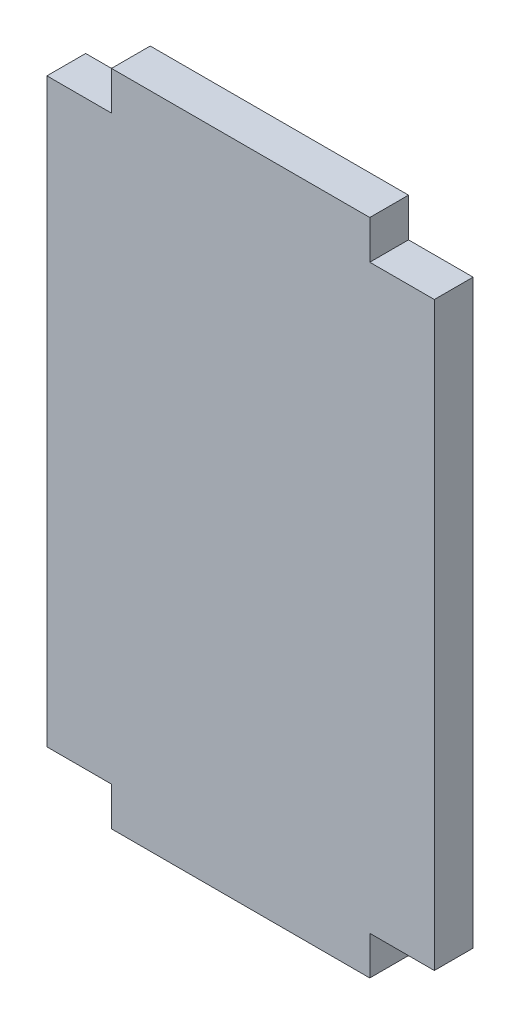
ISO-10303-21;
HEADER;
FILE_DESCRIPTION(('STEP AP214'),'2;1');
FILE_NAME('part.step','',(''),(''),'','','');
FILE_SCHEMA(('AUTOMOTIVE_DESIGN { 1 0 10303 214 1 1 1 1 }'));
ENDSEC;
DATA;
#1=APPLICATION_CONTEXT('core data for automotive mechanical design processes');
#2=APPLICATION_PROTOCOL_DEFINITION('international standard','automotive_design',2000,#1);
#3=PRODUCT_CONTEXT('',#1,'mechanical');
#4=PRODUCT('Part','Part','',(#3));
#5=PRODUCT_RELATED_PRODUCT_CATEGORY('part','',(#4));
#6=PRODUCT_DEFINITION_FORMATION('','',#4);
#7=PRODUCT_DEFINITION_CONTEXT('part definition',#1,'design');
#8=PRODUCT_DEFINITION('design','',#6,#7);
#9=PRODUCT_DEFINITION_SHAPE('','',#8);
#10=(LENGTH_UNIT() NAMED_UNIT(*) SI_UNIT(.MILLI.,.METRE.));
#11=(NAMED_UNIT(*) PLANE_ANGLE_UNIT() SI_UNIT($,.RADIAN.));
#12=(NAMED_UNIT(*) SI_UNIT($,.STERADIAN.) SOLID_ANGLE_UNIT());
#13=UNCERTAINTY_MEASURE_WITH_UNIT(LENGTH_MEASURE(1.E-05),#10,'distance_accuracy_value','');
#14=(GEOMETRIC_REPRESENTATION_CONTEXT(3) GLOBAL_UNCERTAINTY_ASSIGNED_CONTEXT((#13)) GLOBAL_UNIT_ASSIGNED_CONTEXT((#10,
#11,#12)) REPRESENTATION_CONTEXT('',''));
#15=CARTESIAN_POINT('',(0.,0.,0.));
#16=DIRECTION('',(0.,0.,1.));
#17=DIRECTION('',(1.,0.,0.));
#18=AXIS2_PLACEMENT_3D('',#15,#16,#17);
#19=CARTESIAN_POINT('',(-10.,22.5,3.));
#20=DIRECTION('',(1.,0.,0.));
#21=DIRECTION('',(0.,0.,-1.));
#22=AXIS2_PLACEMENT_3D('',#19,#20,#21);
#23=PLANE('',#22);
#24=DIRECTION('',(0.,-1.,0.));
#25=VECTOR('',#24,1.);
#26=CARTESIAN_POINT('',(-10.,22.5,0.));
#27=LINE('',#26,#25);
#28=CARTESIAN_POINT('',(-10.,25.5,0.));
#29=VERTEX_POINT('',#28);
#30=CARTESIAN_POINT('',(-10.,22.5,0.));
#31=VERTEX_POINT('',#30);
#32=EDGE_CURVE('E164',#29,#31,#27,.T.);
#33=ORIENTED_EDGE('',*,*,#32,.T.);
#34=DIRECTION('',(0.,0.,-1.));
#35=VECTOR('',#34,1.);
#36=CARTESIAN_POINT('',(-10.,22.5,3.));
#37=LINE('',#36,#35);
#38=CARTESIAN_POINT('',(-10.,22.5,3.));
#39=VERTEX_POINT('',#38);
#40=EDGE_CURVE('E11',#39,#31,#37,.T.);
#41=ORIENTED_EDGE('',*,*,#40,.F.);
#42=DIRECTION('',(0.,-1.,0.));
#43=VECTOR('',#42,1.);
#44=CARTESIAN_POINT('',(-10.,22.5,3.));
#45=LINE('',#44,#43);
#46=CARTESIAN_POINT('',(-10.,25.5,3.));
#47=VERTEX_POINT('',#46);
#48=EDGE_CURVE('E198',#47,#39,#45,.T.);
#49=ORIENTED_EDGE('',*,*,#48,.F.);
#50=DIRECTION('',(0.,0.,-1.));
#51=VECTOR('',#50,1.);
#52=CARTESIAN_POINT('',(-10.,25.5,3.));
#53=LINE('',#52,#51);
#54=EDGE_CURVE('E160',#47,#29,#53,.T.);
#55=ORIENTED_EDGE('',*,*,#54,.T.);
#56=EDGE_LOOP('',(#33,#41,#49,#55));
#57=FACE_BOUND('',#56,.T.);
#58=ADVANCED_FACE('F39',(#57),#23,.F.);
#59=CARTESIAN_POINT('',(-15.,22.5,3.));
#60=DIRECTION('',(0.,-1.,0.));
#61=DIRECTION('',(1.,0.,0.));
#62=AXIS2_PLACEMENT_3D('',#59,#60,#61);
#63=PLANE('',#62);
#64=DIRECTION('',(-1.,0.,0.));
#65=VECTOR('',#64,1.);
#66=CARTESIAN_POINT('',(-15.,22.5,0.));
#67=LINE('',#66,#65);
#68=CARTESIAN_POINT('',(-15.,22.5,0.));
#69=VERTEX_POINT('',#68);
#70=EDGE_CURVE('E168',#31,#69,#67,.T.);
#71=ORIENTED_EDGE('',*,*,#70,.T.);
#72=DIRECTION('',(0.,0.,-1.));
#73=VECTOR('',#72,1.);
#74=CARTESIAN_POINT('',(-15.,22.5,3.));
#75=LINE('',#74,#73);
#76=CARTESIAN_POINT('',(-15.,22.5,3.));
#77=VERTEX_POINT('',#76);
#78=EDGE_CURVE('E48',#77,#69,#75,.T.);
#79=ORIENTED_EDGE('',*,*,#78,.F.);
#80=DIRECTION('',(-1.,0.,0.));
#81=VECTOR('',#80,1.);
#82=CARTESIAN_POINT('',(-15.,22.5,3.));
#83=LINE('',#82,#81);
#84=EDGE_CURVE('E111',#39,#77,#83,.T.);
#85=ORIENTED_EDGE('',*,*,#84,.F.);
#86=ORIENTED_EDGE('',*,*,#40,.T.);
#87=EDGE_LOOP('',(#71,#79,#85,#86));
#88=FACE_BOUND('',#87,.T.);
#89=ADVANCED_FACE('F292',(#88),#63,.F.);
#90=CARTESIAN_POINT('',(-15.,-22.5,3.));
#91=DIRECTION('',(1.,0.,0.));
#92=DIRECTION('',(0.,0.,-1.));
#93=AXIS2_PLACEMENT_3D('',#90,#91,#92);
#94=PLANE('',#93);
#95=DIRECTION('',(0.,-1.,0.));
#96=VECTOR('',#95,1.);
#97=CARTESIAN_POINT('',(-15.,-22.5,0.));
#98=LINE('',#97,#96);
#99=CARTESIAN_POINT('',(-15.,-22.5,0.));
#100=VERTEX_POINT('',#99);
#101=EDGE_CURVE('E171',#69,#100,#98,.T.);
#102=ORIENTED_EDGE('',*,*,#101,.T.);
#103=DIRECTION('',(0.,0.,-1.));
#104=VECTOR('',#103,1.);
#105=CARTESIAN_POINT('',(-15.,-22.5,3.));
#106=LINE('',#105,#104);
#107=CARTESIAN_POINT('',(-15.,-22.5,3.));
#108=VERTEX_POINT('',#107);
#109=EDGE_CURVE('E225',#108,#100,#106,.T.);
#110=ORIENTED_EDGE('',*,*,#109,.F.);
#111=DIRECTION('',(0.,-1.,0.));
#112=VECTOR('',#111,1.);
#113=CARTESIAN_POINT('',(-15.,-22.5,3.));
#114=LINE('',#113,#112);
#115=EDGE_CURVE('E235',#77,#108,#114,.T.);
#116=ORIENTED_EDGE('',*,*,#115,.F.);
#117=ORIENTED_EDGE('',*,*,#78,.T.);
#118=EDGE_LOOP('',(#102,#110,#116,#117));
#119=FACE_BOUND('',#118,.T.);
#120=ADVANCED_FACE('F233',(#119),#94,.F.);
#121=CARTESIAN_POINT('',(-10.,-22.5,3.));
#122=DIRECTION('',(0.,1.,0.));
#123=DIRECTION('',(-1.,0.,0.));
#124=AXIS2_PLACEMENT_3D('',#121,#122,#123);
#125=PLANE('',#124);
#126=DIRECTION('',(1.,0.,0.));
#127=VECTOR('',#126,1.);
#128=CARTESIAN_POINT('',(-10.,-22.5,0.));
#129=LINE('',#128,#127);
#130=CARTESIAN_POINT('',(-10.,-22.5,0.));
#131=VERTEX_POINT('',#130);
#132=EDGE_CURVE('E174',#100,#131,#129,.T.);
#133=ORIENTED_EDGE('',*,*,#132,.T.);
#134=DIRECTION('',(0.,0.,-1.));
#135=VECTOR('',#134,1.);
#136=CARTESIAN_POINT('',(-10.,-22.5,3.));
#137=LINE('',#136,#135);
#138=CARTESIAN_POINT('',(-10.,-22.5,3.));
#139=VERTEX_POINT('',#138);
#140=EDGE_CURVE('E221',#139,#131,#137,.T.);
#141=ORIENTED_EDGE('',*,*,#140,.F.);
#142=DIRECTION('',(1.,0.,0.));
#143=VECTOR('',#142,1.);
#144=CARTESIAN_POINT('',(-10.,-22.5,3.));
#145=LINE('',#144,#143);
#146=EDGE_CURVE('E254',#108,#139,#145,.T.);
#147=ORIENTED_EDGE('',*,*,#146,.F.);
#148=ORIENTED_EDGE('',*,*,#109,.T.);
#149=EDGE_LOOP('',(#133,#141,#147,#148));
#150=FACE_BOUND('',#149,.T.);
#151=ADVANCED_FACE('F244',(#150),#125,.F.);
#152=CARTESIAN_POINT('',(-10.,-25.5,3.));
#153=DIRECTION('',(1.,0.,0.));
#154=DIRECTION('',(0.,0.,-1.));
#155=AXIS2_PLACEMENT_3D('',#152,#153,#154);
#156=PLANE('',#155);
#157=DIRECTION('',(0.,-1.,0.));
#158=VECTOR('',#157,1.);
#159=CARTESIAN_POINT('',(-10.,-25.5,0.));
#160=LINE('',#159,#158);
#161=CARTESIAN_POINT('',(-10.,-25.5,0.));
#162=VERTEX_POINT('',#161);
#163=EDGE_CURVE('E177',#131,#162,#160,.T.);
#164=ORIENTED_EDGE('',*,*,#163,.T.);
#165=DIRECTION('',(0.,0.,-1.));
#166=VECTOR('',#165,1.);
#167=CARTESIAN_POINT('',(-10.,-25.5,3.));
#168=LINE('',#167,#166);
#169=CARTESIAN_POINT('',(-10.,-25.5,3.));
#170=VERTEX_POINT('',#169);
#171=EDGE_CURVE('E217',#170,#162,#168,.T.);
#172=ORIENTED_EDGE('',*,*,#171,.F.);
#173=DIRECTION('',(0.,-1.,0.));
#174=VECTOR('',#173,1.);
#175=CARTESIAN_POINT('',(-10.,-25.5,3.));
#176=LINE('',#175,#174);
#177=EDGE_CURVE('E250',#139,#170,#176,.T.);
#178=ORIENTED_EDGE('',*,*,#177,.F.);
#179=ORIENTED_EDGE('',*,*,#140,.T.);
#180=EDGE_LOOP('',(#164,#172,#178,#179));
#181=FACE_BOUND('',#180,.T.);
#182=ADVANCED_FACE('F248',(#181),#156,.F.);
#183=CARTESIAN_POINT('',(10.,-25.5,3.));
#184=DIRECTION('',(0.,1.,0.));
#185=DIRECTION('',(0.,0.,1.));
#186=AXIS2_PLACEMENT_3D('',#183,#184,#185);
#187=PLANE('',#186);
#188=DIRECTION('',(1.,0.,0.));
#189=VECTOR('',#188,1.);
#190=CARTESIAN_POINT('',(10.,-25.5,0.));
#191=LINE('',#190,#189);
#192=CARTESIAN_POINT('',(10.,-25.5,0.));
#193=VERTEX_POINT('',#192);
#194=EDGE_CURVE('E180',#162,#193,#191,.T.);
#195=ORIENTED_EDGE('',*,*,#194,.T.);
#196=DIRECTION('',(0.,0.,-1.));
#197=VECTOR('',#196,1.);
#198=CARTESIAN_POINT('',(10.,-25.5,3.));
#199=LINE('',#198,#197);
#200=CARTESIAN_POINT('',(10.,-25.5,3.));
#201=VERTEX_POINT('',#200);
#202=EDGE_CURVE('E213',#201,#193,#199,.T.);
#203=ORIENTED_EDGE('',*,*,#202,.F.);
#204=DIRECTION('',(1.,0.,0.));
#205=VECTOR('',#204,1.);
#206=CARTESIAN_POINT('',(10.,-25.5,3.));
#207=LINE('',#206,#205);
#208=EDGE_CURVE('E253',#170,#201,#207,.T.);
#209=ORIENTED_EDGE('',*,*,#208,.F.);
#210=ORIENTED_EDGE('',*,*,#171,.T.);
#211=EDGE_LOOP('',(#195,#203,#209,#210));
#212=FACE_BOUND('',#211,.T.);
#213=ADVANCED_FACE('F305',(#212),#187,.F.);
#214=CARTESIAN_POINT('',(10.,-22.5,3.));
#215=DIRECTION('',(-1.,0.,0.));
#216=DIRECTION('',(0.,0.,1.));
#217=AXIS2_PLACEMENT_3D('',#214,#215,#216);
#218=PLANE('',#217);
#219=DIRECTION('',(0.,1.,0.));
#220=VECTOR('',#219,1.);
#221=CARTESIAN_POINT('',(10.,-22.5,0.));
#222=LINE('',#221,#220);
#223=CARTESIAN_POINT('',(10.,-22.5,0.));
#224=VERTEX_POINT('',#223);
#225=EDGE_CURVE('E183',#193,#224,#222,.T.);
#226=ORIENTED_EDGE('',*,*,#225,.T.);
#227=DIRECTION('',(0.,0.,-1.));
#228=VECTOR('',#227,1.);
#229=CARTESIAN_POINT('',(10.,-22.5,3.));
#230=LINE('',#229,#228);
#231=CARTESIAN_POINT('',(10.,-22.5,3.));
#232=VERTEX_POINT('',#231);
#233=EDGE_CURVE('E209',#232,#224,#230,.T.);
#234=ORIENTED_EDGE('',*,*,#233,.F.);
#235=DIRECTION('',(0.,1.,0.));
#236=VECTOR('',#235,1.);
#237=CARTESIAN_POINT('',(10.,-22.5,3.));
#238=LINE('',#237,#236);
#239=EDGE_CURVE('E258',#201,#232,#238,.T.);
#240=ORIENTED_EDGE('',*,*,#239,.F.);
#241=ORIENTED_EDGE('',*,*,#202,.T.);
#242=EDGE_LOOP('',(#226,#234,#240,#241));
#243=FACE_BOUND('',#242,.T.);
#244=ADVANCED_FACE('F308',(#243),#218,.F.);
#245=CARTESIAN_POINT('',(15.,-22.5,3.));
#246=DIRECTION('',(0.,1.,0.));
#247=DIRECTION('',(-1.,0.,0.));
#248=AXIS2_PLACEMENT_3D('',#245,#246,#247);
#249=PLANE('',#248);
#250=DIRECTION('',(1.,0.,0.));
#251=VECTOR('',#250,1.);
#252=CARTESIAN_POINT('',(15.,-22.5,0.));
#253=LINE('',#252,#251);
#254=CARTESIAN_POINT('',(15.,-22.5,0.));
#255=VERTEX_POINT('',#254);
#256=EDGE_CURVE('E186',#224,#255,#253,.T.);
#257=ORIENTED_EDGE('',*,*,#256,.T.);
#258=DIRECTION('',(0.,0.,-1.));
#259=VECTOR('',#258,1.);
#260=CARTESIAN_POINT('',(15.,-22.5,3.));
#261=LINE('',#260,#259);
#262=CARTESIAN_POINT('',(15.,-22.5,3.));
#263=VERTEX_POINT('',#262);
#264=EDGE_CURVE('E205',#263,#255,#261,.T.);
#265=ORIENTED_EDGE('',*,*,#264,.F.);
#266=DIRECTION('',(1.,0.,0.));
#267=VECTOR('',#266,1.);
#268=CARTESIAN_POINT('',(15.,-22.5,3.));
#269=LINE('',#268,#267);
#270=EDGE_CURVE('E265',#232,#263,#269,.T.);
#271=ORIENTED_EDGE('',*,*,#270,.F.);
#272=ORIENTED_EDGE('',*,*,#233,.T.);
#273=EDGE_LOOP('',(#257,#265,#271,#272));
#274=FACE_BOUND('',#273,.T.);
#275=ADVANCED_FACE('F273',(#274),#249,.F.);
#276=CARTESIAN_POINT('',(15.,22.5,3.));
#277=DIRECTION('',(-1.,0.,0.));
#278=DIRECTION('',(0.,0.,1.));
#279=AXIS2_PLACEMENT_3D('',#276,#277,#278);
#280=PLANE('',#279);
#281=DIRECTION('',(0.,1.,0.));
#282=VECTOR('',#281,1.);
#283=CARTESIAN_POINT('',(15.,22.5,0.));
#284=LINE('',#283,#282);
#285=CARTESIAN_POINT('',(15.,22.5,0.));
#286=VERTEX_POINT('',#285);
#287=EDGE_CURVE('E189',#255,#286,#284,.T.);
#288=ORIENTED_EDGE('',*,*,#287,.T.);
#289=DIRECTION('',(0.,0.,-1.));
#290=VECTOR('',#289,1.);
#291=CARTESIAN_POINT('',(15.,22.5,3.));
#292=LINE('',#291,#290);
#293=CARTESIAN_POINT('',(15.,22.5,3.));
#294=VERTEX_POINT('',#293);
#295=EDGE_CURVE('E153',#294,#286,#292,.T.);
#296=ORIENTED_EDGE('',*,*,#295,.F.);
#297=DIRECTION('',(0.,1.,0.));
#298=VECTOR('',#297,1.);
#299=CARTESIAN_POINT('',(15.,22.5,3.));
#300=LINE('',#299,#298);
#301=EDGE_CURVE('E142',#263,#294,#300,.T.);
#302=ORIENTED_EDGE('',*,*,#301,.F.);
#303=ORIENTED_EDGE('',*,*,#264,.T.);
#304=EDGE_LOOP('',(#288,#296,#302,#303));
#305=FACE_BOUND('',#304,.T.);
#306=ADVANCED_FACE('F277',(#305),#280,.F.);
#307=CARTESIAN_POINT('',(10.,22.5,3.));
#308=DIRECTION('',(0.,-1.,0.));
#309=DIRECTION('',(1.,0.,0.));
#310=AXIS2_PLACEMENT_3D('',#307,#308,#309);
#311=PLANE('',#310);
#312=DIRECTION('',(-1.,0.,0.));
#313=VECTOR('',#312,1.);
#314=CARTESIAN_POINT('',(10.,22.5,0.));
#315=LINE('',#314,#313);
#316=CARTESIAN_POINT('',(10.,22.5,0.));
#317=VERTEX_POINT('',#316);
#318=EDGE_CURVE('E151',#286,#317,#315,.T.);
#319=ORIENTED_EDGE('',*,*,#318,.T.);
#320=DIRECTION('',(0.,0.,-1.));
#321=VECTOR('',#320,1.);
#322=CARTESIAN_POINT('',(10.,22.5,3.));
#323=LINE('',#322,#321);
#324=CARTESIAN_POINT('',(10.,22.5,3.));
#325=VERTEX_POINT('',#324);
#326=EDGE_CURVE('E148',#325,#317,#323,.T.);
#327=ORIENTED_EDGE('',*,*,#326,.F.);
#328=DIRECTION('',(-1.,0.,0.));
#329=VECTOR('',#328,1.);
#330=CARTESIAN_POINT('',(10.,22.5,3.));
#331=LINE('',#330,#329);
#332=EDGE_CURVE('E136',#294,#325,#331,.T.);
#333=ORIENTED_EDGE('',*,*,#332,.F.);
#334=ORIENTED_EDGE('',*,*,#295,.T.);
#335=EDGE_LOOP('',(#319,#327,#333,#334));
#336=FACE_BOUND('',#335,.T.);
#337=ADVANCED_FACE('F149',(#336),#311,.F.);
#338=CARTESIAN_POINT('',(10.,25.5,3.));
#339=DIRECTION('',(-1.,0.,0.));
#340=DIRECTION('',(0.,0.,1.));
#341=AXIS2_PLACEMENT_3D('',#338,#339,#340);
#342=PLANE('',#341);
#343=DIRECTION('',(0.,1.,0.));
#344=VECTOR('',#343,1.);
#345=CARTESIAN_POINT('',(10.,25.5,0.));
#346=LINE('',#345,#344);
#347=CARTESIAN_POINT('',(10.,25.5,0.));
#348=VERTEX_POINT('',#347);
#349=EDGE_CURVE('E97',#317,#348,#346,.T.);
#350=ORIENTED_EDGE('',*,*,#349,.T.);
#351=DIRECTION('',(0.,0.,-1.));
#352=VECTOR('',#351,1.);
#353=CARTESIAN_POINT('',(10.,25.5,3.));
#354=LINE('',#353,#352);
#355=CARTESIAN_POINT('',(10.,25.5,3.));
#356=VERTEX_POINT('',#355);
#357=EDGE_CURVE('E154',#356,#348,#354,.T.);
#358=ORIENTED_EDGE('',*,*,#357,.F.);
#359=DIRECTION('',(0.,1.,0.));
#360=VECTOR('',#359,1.);
#361=CARTESIAN_POINT('',(10.,25.5,3.));
#362=LINE('',#361,#360);
#363=EDGE_CURVE('E140',#325,#356,#362,.T.);
#364=ORIENTED_EDGE('',*,*,#363,.F.);
#365=ORIENTED_EDGE('',*,*,#326,.T.);
#366=EDGE_LOOP('',(#350,#358,#364,#365));
#367=FACE_BOUND('',#366,.T.);
#368=ADVANCED_FACE('F156',(#367),#342,.F.);
#369=CARTESIAN_POINT('',(-10.,25.5,3.));
#370=DIRECTION('',(0.,-1.,0.));
#371=DIRECTION('',(1.,0.,0.));
#372=AXIS2_PLACEMENT_3D('',#369,#370,#371);
#373=PLANE('',#372);
#374=DIRECTION('',(-1.,0.,0.));
#375=VECTOR('',#374,1.);
#376=CARTESIAN_POINT('',(-10.,25.5,0.));
#377=LINE('',#376,#375);
#378=EDGE_CURVE('E103',#348,#29,#377,.T.);
#379=ORIENTED_EDGE('',*,*,#378,.T.);
#380=ORIENTED_EDGE('',*,*,#54,.F.);
#381=DIRECTION('',(-1.,0.,0.));
#382=VECTOR('',#381,1.);
#383=CARTESIAN_POINT('',(-10.,25.5,3.));
#384=LINE('',#383,#382);
#385=EDGE_CURVE('E56',#356,#47,#384,.T.);
#386=ORIENTED_EDGE('',*,*,#385,.F.);
#387=ORIENTED_EDGE('',*,*,#357,.T.);
#388=EDGE_LOOP('',(#379,#380,#386,#387));
#389=FACE_BOUND('',#388,.T.);
#390=ADVANCED_FACE('F281',(#389),#373,.F.);
#391=CARTESIAN_POINT('',(0.,0.,3.));
#392=DIRECTION('',(0.,0.,-1.));
#393=DIRECTION('',(-1.,0.,0.));
#394=AXIS2_PLACEMENT_3D('',#391,#392,#393);
#395=PLANE('',#394);
#396=ORIENTED_EDGE('',*,*,#48,.T.);
#397=ORIENTED_EDGE('',*,*,#84,.T.);
#398=ORIENTED_EDGE('',*,*,#115,.T.);
#399=ORIENTED_EDGE('',*,*,#146,.T.);
#400=ORIENTED_EDGE('',*,*,#177,.T.);
#401=ORIENTED_EDGE('',*,*,#208,.T.);
#402=ORIENTED_EDGE('',*,*,#239,.T.);
#403=ORIENTED_EDGE('',*,*,#270,.T.);
#404=ORIENTED_EDGE('',*,*,#301,.T.);
#405=ORIENTED_EDGE('',*,*,#332,.T.);
#406=ORIENTED_EDGE('',*,*,#363,.T.);
#407=ORIENTED_EDGE('',*,*,#385,.T.);
#408=EDGE_LOOP('',(#396,#397,#398,#399,#400,#401,#402,#403,#404,#405,#406,#407));
#409=FACE_BOUND('',#408,.T.);
#410=ADVANCED_FACE('F138',(#409),#395,.F.);
#411=CARTESIAN_POINT('',(0.,0.,0.));
#412=DIRECTION('',(0.,0.,-1.));
#413=DIRECTION('',(-1.,0.,0.));
#414=AXIS2_PLACEMENT_3D('',#411,#412,#413);
#415=PLANE('',#414);
#416=ORIENTED_EDGE('',*,*,#32,.F.);
#417=ORIENTED_EDGE('',*,*,#378,.F.);
#418=ORIENTED_EDGE('',*,*,#349,.F.);
#419=ORIENTED_EDGE('',*,*,#318,.F.);
#420=ORIENTED_EDGE('',*,*,#287,.F.);
#421=ORIENTED_EDGE('',*,*,#256,.F.);
#422=ORIENTED_EDGE('',*,*,#225,.F.);
#423=ORIENTED_EDGE('',*,*,#194,.F.);
#424=ORIENTED_EDGE('',*,*,#163,.F.);
#425=ORIENTED_EDGE('',*,*,#132,.F.);
#426=ORIENTED_EDGE('',*,*,#101,.F.);
#427=ORIENTED_EDGE('',*,*,#70,.F.);
#428=EDGE_LOOP('',(#416,#417,#418,#419,#420,#421,#422,#423,#424,#425,#426,#427));
#429=FACE_BOUND('',#428,.T.);
#430=ADVANCED_FACE('F239',(#429),#415,.T.);
#431=CLOSED_SHELL('',(#58,#89,#120,#151,#182,#213,#244,#275,#306,#337,#368,#390,#410,#430));
#432=MANIFOLD_SOLID_BREP('B2',#431);
#433=ADVANCED_BREP_SHAPE_REPRESENTATION('',(#18,#432),#14);
#434=SHAPE_DEFINITION_REPRESENTATION(#9,#433);
ENDSEC;
END-ISO-10303-21;
